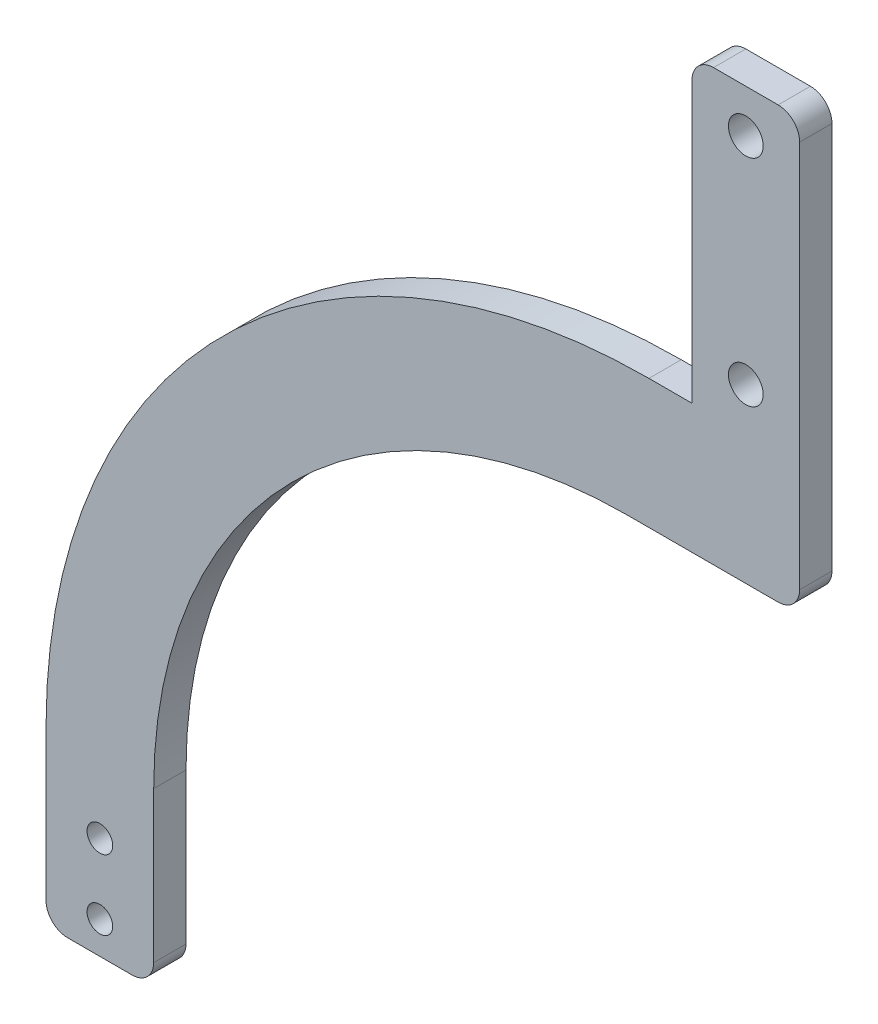
ISO-10303-21;
HEADER;
FILE_DESCRIPTION(('STEP AP214'),'2;1');
FILE_NAME('part.step','',(''),(''),'','','');
FILE_SCHEMA(('AUTOMOTIVE_DESIGN { 1 0 10303 214 1 1 1 1 }'));
ENDSEC;
DATA;
#1=APPLICATION_CONTEXT('core data for automotive mechanical design processes');
#2=APPLICATION_PROTOCOL_DEFINITION('international standard','automotive_design',2000,#1);
#3=PRODUCT_CONTEXT('',#1,'mechanical');
#4=PRODUCT('Part','Part','',(#3));
#5=PRODUCT_RELATED_PRODUCT_CATEGORY('part','',(#4));
#6=PRODUCT_DEFINITION_FORMATION('','',#4);
#7=PRODUCT_DEFINITION_CONTEXT('part definition',#1,'design');
#8=PRODUCT_DEFINITION('design','',#6,#7);
#9=PRODUCT_DEFINITION_SHAPE('','',#8);
#10=(LENGTH_UNIT() NAMED_UNIT(*) SI_UNIT(.MILLI.,.METRE.));
#11=(NAMED_UNIT(*) PLANE_ANGLE_UNIT() SI_UNIT($,.RADIAN.));
#12=(NAMED_UNIT(*) SI_UNIT($,.STERADIAN.) SOLID_ANGLE_UNIT());
#13=UNCERTAINTY_MEASURE_WITH_UNIT(LENGTH_MEASURE(1.E-05),#10,'distance_accuracy_value','');
#14=(GEOMETRIC_REPRESENTATION_CONTEXT(3) GLOBAL_UNCERTAINTY_ASSIGNED_CONTEXT((#13)) GLOBAL_UNIT_ASSIGNED_CONTEXT((#10,
#11,#12)) REPRESENTATION_CONTEXT('',''));
#15=CARTESIAN_POINT('',(0.,0.,0.));
#16=DIRECTION('',(0.,0.,1.));
#17=DIRECTION('',(1.,0.,0.));
#18=AXIS2_PLACEMENT_3D('',#15,#16,#17);
#19=CARTESIAN_POINT('',(0.,0.,1.5));
#20=DIRECTION('',(0.,0.,1.));
#21=DIRECTION('',(1.,0.,0.));
#22=AXIS2_PLACEMENT_3D('',#19,#20,#21);
#23=PLANE('',#22);
#24=CARTESIAN_POINT('',(30.,44.875,1.5));
#25=DIRECTION('',(0.,0.,1.));
#26=DIRECTION('',(1.,0.,0.));
#27=AXIS2_PLACEMENT_3D('',#24,#25,#26);
#28=CIRCLE('',#27,0.806450000000001);
#29=CARTESIAN_POINT('',(30.80645,44.875,1.5));
#30=VERTEX_POINT('',#29);
#31=EDGE_CURVE('E512',#30,#30,#28,.T.);
#32=ORIENTED_EDGE('',*,*,#31,.F.);
#33=EDGE_LOOP('',(#32));
#34=FACE_BOUND('',#33,.T.);
#35=CARTESIAN_POINT('',(0.,1.625,1.5));
#36=DIRECTION('',(0.,0.,1.));
#37=DIRECTION('',(1.,0.,0.));
#38=AXIS2_PLACEMENT_3D('',#35,#36,#37);
#39=CIRCLE('',#38,0.59563);
#40=CARTESIAN_POINT('',(0.595629999999999,1.625,1.5));
#41=VERTEX_POINT('',#40);
#42=EDGE_CURVE('E182',#41,#41,#39,.T.);
#43=ORIENTED_EDGE('',*,*,#42,.F.);
#44=EDGE_LOOP('',(#43));
#45=FACE_BOUND('',#44,.T.);
#46=DIRECTION('',(1.,0.,0.));
#47=VECTOR('',#46,1.);
#48=CARTESIAN_POINT('',(32.5,26.875,1.5));
#49=LINE('',#48,#47);
#50=CARTESIAN_POINT('',(24.5,26.875,1.5));
#51=VERTEX_POINT('',#50);
#52=CARTESIAN_POINT('',(31.5,26.875,1.5));
#53=VERTEX_POINT('',#52);
#54=EDGE_CURVE('E281',#51,#53,#49,.T.);
#55=ORIENTED_EDGE('',*,*,#54,.T.);
#56=CARTESIAN_POINT('',(31.5,27.875,1.5));
#57=DIRECTION('',(0.,0.,1.));
#58=DIRECTION('',(1.,0.,0.));
#59=AXIS2_PLACEMENT_3D('',#56,#57,#58);
#60=CIRCLE('',#59,1.);
#61=CARTESIAN_POINT('',(32.5,27.875,1.5));
#62=VERTEX_POINT('',#61);
#63=EDGE_CURVE('E242',#53,#62,#60,.T.);
#64=ORIENTED_EDGE('',*,*,#63,.T.);
#65=DIRECTION('',(0.,1.,0.));
#66=VECTOR('',#65,1.);
#67=CARTESIAN_POINT('',(32.5,32.875,1.5));
#68=LINE('',#67,#66);
#69=CARTESIAN_POINT('',(32.5,45.875,1.5));
#70=VERTEX_POINT('',#69);
#71=EDGE_CURVE('E286',#62,#70,#68,.T.);
#72=ORIENTED_EDGE('',*,*,#71,.T.);
#73=CARTESIAN_POINT('',(31.5,45.875,1.5));
#74=DIRECTION('',(0.,0.,1.));
#75=DIRECTION('',(1.,0.,0.));
#76=AXIS2_PLACEMENT_3D('',#73,#74,#75);
#77=CIRCLE('',#76,1.);
#78=CARTESIAN_POINT('',(31.5,46.875,1.5));
#79=VERTEX_POINT('',#78);
#80=EDGE_CURVE('E240',#70,#79,#77,.T.);
#81=ORIENTED_EDGE('',*,*,#80,.T.);
#82=DIRECTION('',(-1.,0.,0.));
#83=VECTOR('',#82,1.);
#84=CARTESIAN_POINT('',(27.5,46.875,1.5));
#85=LINE('',#84,#83);
#86=CARTESIAN_POINT('',(28.5,46.875,1.5));
#87=VERTEX_POINT('',#86);
#88=EDGE_CURVE('E155',#79,#87,#85,.T.);
#89=ORIENTED_EDGE('',*,*,#88,.T.);
#90=CARTESIAN_POINT('',(28.5,45.875,1.5));
#91=DIRECTION('',(0.,0.,1.));
#92=DIRECTION('',(1.,0.,0.));
#93=AXIS2_PLACEMENT_3D('',#90,#91,#92);
#94=CIRCLE('',#93,1.);
#95=CARTESIAN_POINT('',(27.5,45.875,1.5));
#96=VERTEX_POINT('',#95);
#97=EDGE_CURVE('E54',#87,#96,#94,.T.);
#98=ORIENTED_EDGE('',*,*,#97,.T.);
#99=DIRECTION('',(0.,-1.,0.));
#100=VECTOR('',#99,1.);
#101=CARTESIAN_POINT('',(27.5,46.875,1.5));
#102=LINE('',#101,#100);
#103=CARTESIAN_POINT('',(27.5,32.875,1.5));
#104=VERTEX_POINT('',#103);
#105=EDGE_CURVE('E145',#96,#104,#102,.T.);
#106=ORIENTED_EDGE('',*,*,#105,.T.);
#107=DIRECTION('',(-1.,0.,0.));
#108=VECTOR('',#107,1.);
#109=CARTESIAN_POINT('',(-2.5,32.875,1.5));
#110=LINE('',#109,#108);
#111=CARTESIAN_POINT('',(25.5,32.875,1.5));
#112=VERTEX_POINT('',#111);
#113=EDGE_CURVE('E150',#104,#112,#110,.T.);
#114=ORIENTED_EDGE('',*,*,#113,.T.);
#115=CARTESIAN_POINT('',(25.5,4.87499999999999,1.5));
#116=DIRECTION('',(0.,0.,1.));
#117=DIRECTION('',(1.,0.,0.));
#118=AXIS2_PLACEMENT_3D('',#115,#116,#117);
#119=CIRCLE('',#118,28.);
#120=CARTESIAN_POINT('',(-2.5,4.87499999999999,1.5));
#121=VERTEX_POINT('',#120);
#122=EDGE_CURVE('E216',#112,#121,#119,.T.);
#123=ORIENTED_EDGE('',*,*,#122,.T.);
#124=DIRECTION('',(0.,-1.,0.));
#125=VECTOR('',#124,1.);
#126=CARTESIAN_POINT('',(-2.5,3.875,1.5));
#127=LINE('',#126,#125);
#128=CARTESIAN_POINT('',(-2.5,-2.125,1.5));
#129=VERTEX_POINT('',#128);
#130=EDGE_CURVE('E171',#121,#129,#127,.T.);
#131=ORIENTED_EDGE('',*,*,#130,.T.);
#132=CARTESIAN_POINT('',(-1.5,-2.125,1.5));
#133=DIRECTION('',(0.,0.,1.));
#134=DIRECTION('',(1.,0.,0.));
#135=AXIS2_PLACEMENT_3D('',#132,#133,#134);
#136=CIRCLE('',#135,1.);
#137=CARTESIAN_POINT('',(-1.5,-3.125,1.5));
#138=VERTEX_POINT('',#137);
#139=EDGE_CURVE('E235',#129,#138,#136,.T.);
#140=ORIENTED_EDGE('',*,*,#139,.T.);
#141=DIRECTION('',(1.,0.,0.));
#142=VECTOR('',#141,1.);
#143=CARTESIAN_POINT('',(2.5,-3.125,1.5));
#144=LINE('',#143,#142);
#145=CARTESIAN_POINT('',(1.5,-3.125,1.5));
#146=VERTEX_POINT('',#145);
#147=EDGE_CURVE('E166',#138,#146,#144,.T.);
#148=ORIENTED_EDGE('',*,*,#147,.T.);
#149=CARTESIAN_POINT('',(1.5,-2.125,1.5));
#150=DIRECTION('',(0.,0.,1.));
#151=DIRECTION('',(1.,0.,0.));
#152=AXIS2_PLACEMENT_3D('',#149,#150,#151);
#153=CIRCLE('',#152,1.);
#154=CARTESIAN_POINT('',(2.5,-2.125,1.5));
#155=VERTEX_POINT('',#154);
#156=EDGE_CURVE('E237',#146,#155,#153,.T.);
#157=ORIENTED_EDGE('',*,*,#156,.T.);
#158=DIRECTION('',(0.,1.,0.));
#159=VECTOR('',#158,1.);
#160=CARTESIAN_POINT('',(2.5,-3.125,1.5));
#161=LINE('',#160,#159);
#162=CARTESIAN_POINT('',(2.5,4.875,1.5));
#163=VERTEX_POINT('',#162);
#164=EDGE_CURVE('E198',#155,#163,#161,.T.);
#165=ORIENTED_EDGE('',*,*,#164,.T.);
#166=CARTESIAN_POINT('',(24.5,4.875,1.5));
#167=DIRECTION('',(0.,0.,1.));
#168=DIRECTION('',(1.,0.,0.));
#169=AXIS2_PLACEMENT_3D('',#166,#167,#168);
#170=CIRCLE('',#169,22.);
#171=EDGE_CURVE('E208',#163,#51,#170,.F.);
#172=ORIENTED_EDGE('',*,*,#171,.T.);
#173=EDGE_LOOP('',(#55,#64,#72,#81,#89,#98,#106,#114,#123,#131,#140,#148,#157,#165,#172));
#174=FACE_BOUND('',#173,.T.);
#175=CARTESIAN_POINT('',(0.,-1.625,1.5));
#176=DIRECTION('',(0.,0.,1.));
#177=DIRECTION('',(1.,0.,0.));
#178=AXIS2_PLACEMENT_3D('',#175,#176,#177);
#179=CIRCLE('',#178,0.59563);
#180=CARTESIAN_POINT('',(0.59563,-1.625,1.5));
#181=VERTEX_POINT('',#180);
#182=EDGE_CURVE('E505',#181,#181,#179,.T.);
#183=ORIENTED_EDGE('',*,*,#182,.F.);
#184=EDGE_LOOP('',(#183));
#185=FACE_BOUND('',#184,.T.);
#186=CARTESIAN_POINT('',(30.,34.875,1.5));
#187=DIRECTION('',(0.,0.,1.));
#188=DIRECTION('',(1.,0.,0.));
#189=AXIS2_PLACEMENT_3D('',#186,#187,#188);
#190=CIRCLE('',#189,0.806450000000001);
#191=CARTESIAN_POINT('',(30.80645,34.875,1.5));
#192=VERTEX_POINT('',#191);
#193=EDGE_CURVE('E517',#192,#192,#190,.T.);
#194=ORIENTED_EDGE('',*,*,#193,.F.);
#195=EDGE_LOOP('',(#194));
#196=FACE_BOUND('',#195,.T.);
#197=ADVANCED_FACE('F39',(#34,#45,#174,#185,#196),#23,.T.);
#198=CARTESIAN_POINT('',(0.,0.,0.));
#199=DIRECTION('',(0.,0.,1.));
#200=DIRECTION('',(1.,0.,0.));
#201=AXIS2_PLACEMENT_3D('',#198,#199,#200);
#202=PLANE('',#201);
#203=DIRECTION('',(0.,1.,0.));
#204=VECTOR('',#203,1.);
#205=CARTESIAN_POINT('',(32.5,46.875,0.));
#206=LINE('',#205,#204);
#207=CARTESIAN_POINT('',(32.5,27.875,0.));
#208=VERTEX_POINT('',#207);
#209=CARTESIAN_POINT('',(32.5,45.875,0.));
#210=VERTEX_POINT('',#209);
#211=EDGE_CURVE('E185',#208,#210,#206,.T.);
#212=ORIENTED_EDGE('',*,*,#211,.F.);
#213=CARTESIAN_POINT('',(31.5,27.875,0.));
#214=DIRECTION('',(0.,0.,1.));
#215=DIRECTION('',(1.,0.,0.));
#216=AXIS2_PLACEMENT_3D('',#213,#214,#215);
#217=CIRCLE('',#216,1.);
#218=CARTESIAN_POINT('',(31.5,26.875,0.));
#219=VERTEX_POINT('',#218);
#220=EDGE_CURVE('E231',#208,#219,#217,.F.);
#221=ORIENTED_EDGE('',*,*,#220,.T.);
#222=DIRECTION('',(1.,0.,0.));
#223=VECTOR('',#222,1.);
#224=CARTESIAN_POINT('',(32.5,26.875,0.));
#225=LINE('',#224,#223);
#226=CARTESIAN_POINT('',(24.5,26.875,0.));
#227=VERTEX_POINT('',#226);
#228=EDGE_CURVE('E181',#227,#219,#225,.T.);
#229=ORIENTED_EDGE('',*,*,#228,.F.);
#230=CARTESIAN_POINT('',(24.5,4.875,0.));
#231=DIRECTION('',(0.,0.,1.));
#232=DIRECTION('',(1.,0.,0.));
#233=AXIS2_PLACEMENT_3D('',#230,#231,#232);
#234=CIRCLE('',#233,22.);
#235=CARTESIAN_POINT('',(2.5,4.875,0.));
#236=VERTEX_POINT('',#235);
#237=EDGE_CURVE('E205',#227,#236,#234,.T.);
#238=ORIENTED_EDGE('',*,*,#237,.T.);
#239=DIRECTION('',(0.,1.,0.));
#240=VECTOR('',#239,1.);
#241=CARTESIAN_POINT('',(2.5,26.875,0.));
#242=LINE('',#241,#240);
#243=CARTESIAN_POINT('',(2.5,-2.125,0.));
#244=VERTEX_POINT('',#243);
#245=EDGE_CURVE('E179',#244,#236,#242,.T.);
#246=ORIENTED_EDGE('',*,*,#245,.F.);
#247=CARTESIAN_POINT('',(1.5,-2.125,0.));
#248=DIRECTION('',(0.,0.,1.));
#249=DIRECTION('',(1.,0.,0.));
#250=AXIS2_PLACEMENT_3D('',#247,#248,#249);
#251=CIRCLE('',#250,1.);
#252=CARTESIAN_POINT('',(1.5,-3.125,0.));
#253=VERTEX_POINT('',#252);
#254=EDGE_CURVE('E225',#244,#253,#251,.F.);
#255=ORIENTED_EDGE('',*,*,#254,.T.);
#256=DIRECTION('',(1.,0.,0.));
#257=VECTOR('',#256,1.);
#258=CARTESIAN_POINT('',(2.5,-3.125,0.));
#259=LINE('',#258,#257);
#260=CARTESIAN_POINT('',(-1.5,-3.125,0.));
#261=VERTEX_POINT('',#260);
#262=EDGE_CURVE('E196',#261,#253,#259,.T.);
#263=ORIENTED_EDGE('',*,*,#262,.F.);
#264=CARTESIAN_POINT('',(-1.5,-2.125,0.));
#265=DIRECTION('',(0.,0.,1.));
#266=DIRECTION('',(1.,0.,0.));
#267=AXIS2_PLACEMENT_3D('',#264,#265,#266);
#268=CIRCLE('',#267,1.);
#269=CARTESIAN_POINT('',(-2.5,-2.125,0.));
#270=VERTEX_POINT('',#269);
#271=EDGE_CURVE('E223',#261,#270,#268,.F.);
#272=ORIENTED_EDGE('',*,*,#271,.T.);
#273=DIRECTION('',(0.,-1.,0.));
#274=VECTOR('',#273,1.);
#275=CARTESIAN_POINT('',(-2.5,-3.125,0.));
#276=LINE('',#275,#274);
#277=CARTESIAN_POINT('',(-2.5,4.87499999999999,0.));
#278=VERTEX_POINT('',#277);
#279=EDGE_CURVE('E193',#278,#270,#276,.T.);
#280=ORIENTED_EDGE('',*,*,#279,.F.);
#281=CARTESIAN_POINT('',(25.5,4.87499999999999,0.));
#282=DIRECTION('',(0.,0.,1.));
#283=DIRECTION('',(1.,0.,0.));
#284=AXIS2_PLACEMENT_3D('',#281,#282,#283);
#285=CIRCLE('',#284,28.);
#286=CARTESIAN_POINT('',(25.5,32.875,0.));
#287=VERTEX_POINT('',#286);
#288=EDGE_CURVE('E213',#278,#287,#285,.F.);
#289=ORIENTED_EDGE('',*,*,#288,.T.);
#290=DIRECTION('',(-1.,0.,0.));
#291=VECTOR('',#290,1.);
#292=CARTESIAN_POINT('',(-2.5,32.875,0.));
#293=LINE('',#292,#291);
#294=CARTESIAN_POINT('',(27.5,32.875,0.));
#295=VERTEX_POINT('',#294);
#296=EDGE_CURVE('E191',#295,#287,#293,.T.);
#297=ORIENTED_EDGE('',*,*,#296,.F.);
#298=DIRECTION('',(0.,-1.,0.));
#299=VECTOR('',#298,1.);
#300=CARTESIAN_POINT('',(27.5,46.875,0.));
#301=LINE('',#300,#299);
#302=CARTESIAN_POINT('',(27.5,45.875,0.));
#303=VERTEX_POINT('',#302);
#304=EDGE_CURVE('E161',#303,#295,#301,.T.);
#305=ORIENTED_EDGE('',*,*,#304,.F.);
#306=CARTESIAN_POINT('',(28.5,45.875,0.));
#307=DIRECTION('',(0.,0.,1.));
#308=DIRECTION('',(1.,0.,0.));
#309=AXIS2_PLACEMENT_3D('',#306,#307,#308);
#310=CIRCLE('',#309,1.);
#311=CARTESIAN_POINT('',(28.5,46.875,0.));
#312=VERTEX_POINT('',#311);
#313=EDGE_CURVE('E227',#303,#312,#310,.F.);
#314=ORIENTED_EDGE('',*,*,#313,.T.);
#315=DIRECTION('',(-1.,0.,0.));
#316=VECTOR('',#315,1.);
#317=CARTESIAN_POINT('',(27.5,46.875,0.));
#318=LINE('',#317,#316);
#319=CARTESIAN_POINT('',(31.5,46.875,0.));
#320=VERTEX_POINT('',#319);
#321=EDGE_CURVE('E188',#320,#312,#318,.T.);
#322=ORIENTED_EDGE('',*,*,#321,.F.);
#323=CARTESIAN_POINT('',(31.5,45.875,0.));
#324=DIRECTION('',(0.,0.,1.));
#325=DIRECTION('',(1.,0.,0.));
#326=AXIS2_PLACEMENT_3D('',#323,#324,#325);
#327=CIRCLE('',#326,1.);
#328=EDGE_CURVE('E229',#320,#210,#327,.F.);
#329=ORIENTED_EDGE('',*,*,#328,.T.);
#330=EDGE_LOOP('',(#212,#221,#229,#238,#246,#255,#263,#272,#280,#289,#297,#305,#314,#322,#329));
#331=FACE_BOUND('',#330,.T.);
#332=CARTESIAN_POINT('',(0.,1.625,0.));
#333=DIRECTION('',(0.,0.,1.));
#334=DIRECTION('',(1.,0.,0.));
#335=AXIS2_PLACEMENT_3D('',#332,#333,#334);
#336=CIRCLE('',#335,0.59563);
#337=CARTESIAN_POINT('',(0.595629999999999,1.625,0.));
#338=VERTEX_POINT('',#337);
#339=EDGE_CURVE('E504',#338,#338,#336,.T.);
#340=ORIENTED_EDGE('',*,*,#339,.T.);
#341=EDGE_LOOP('',(#340));
#342=FACE_BOUND('',#341,.T.);
#343=CARTESIAN_POINT('',(0.,-1.625,0.));
#344=DIRECTION('',(0.,0.,1.));
#345=DIRECTION('',(1.,0.,0.));
#346=AXIS2_PLACEMENT_3D('',#343,#344,#345);
#347=CIRCLE('',#346,0.59563);
#348=CARTESIAN_POINT('',(0.59563,-1.625,0.));
#349=VERTEX_POINT('',#348);
#350=EDGE_CURVE('E508',#349,#349,#347,.T.);
#351=ORIENTED_EDGE('',*,*,#350,.T.);
#352=EDGE_LOOP('',(#351));
#353=FACE_BOUND('',#352,.T.);
#354=CARTESIAN_POINT('',(30.,44.875,0.));
#355=DIRECTION('',(0.,0.,1.));
#356=DIRECTION('',(1.,0.,0.));
#357=AXIS2_PLACEMENT_3D('',#354,#355,#356);
#358=CIRCLE('',#357,0.806450000000001);
#359=CARTESIAN_POINT('',(30.80645,44.875,0.));
#360=VERTEX_POINT('',#359);
#361=EDGE_CURVE('E514',#360,#360,#358,.T.);
#362=ORIENTED_EDGE('',*,*,#361,.T.);
#363=EDGE_LOOP('',(#362));
#364=FACE_BOUND('',#363,.T.);
#365=CARTESIAN_POINT('',(30.,34.875,0.));
#366=DIRECTION('',(0.,0.,1.));
#367=DIRECTION('',(1.,0.,0.));
#368=AXIS2_PLACEMENT_3D('',#365,#366,#367);
#369=CIRCLE('',#368,0.806450000000001);
#370=CARTESIAN_POINT('',(30.80645,34.875,0.));
#371=VERTEX_POINT('',#370);
#372=EDGE_CURVE('E520',#371,#371,#369,.T.);
#373=ORIENTED_EDGE('',*,*,#372,.T.);
#374=EDGE_LOOP('',(#373));
#375=FACE_BOUND('',#374,.T.);
#376=ADVANCED_FACE('F272',(#331,#342,#353,#364,#375),#202,.F.);
#377=CARTESIAN_POINT('',(2.5,26.875,1.5));
#378=DIRECTION('',(-1.,0.,0.));
#379=DIRECTION('',(0.,-1.,0.));
#380=AXIS2_PLACEMENT_3D('',#377,#378,#379);
#381=PLANE('',#380);
#382=ORIENTED_EDGE('',*,*,#164,.F.);
#383=DIRECTION('',(0.,0.,-1.));
#384=VECTOR('',#383,1.);
#385=CARTESIAN_POINT('',(2.5,-2.125,1.5));
#386=LINE('',#385,#384);
#387=EDGE_CURVE('E250',#155,#244,#386,.T.);
#388=ORIENTED_EDGE('',*,*,#387,.T.);
#389=ORIENTED_EDGE('',*,*,#245,.T.);
#390=DIRECTION('',(0.,0.,-1.));
#391=VECTOR('',#390,1.);
#392=CARTESIAN_POINT('',(2.5,4.875,1.5));
#393=LINE('',#392,#391);
#394=EDGE_CURVE('E202',#236,#163,#393,.F.);
#395=ORIENTED_EDGE('',*,*,#394,.T.);
#396=EDGE_LOOP('',(#382,#388,#389,#395));
#397=FACE_BOUND('',#396,.T.);
#398=ADVANCED_FACE('F269',(#397),#381,.F.);
#399=CARTESIAN_POINT('',(32.5,26.875,1.5));
#400=DIRECTION('',(0.,1.,0.));
#401=DIRECTION('',(-1.,0.,0.));
#402=AXIS2_PLACEMENT_3D('',#399,#400,#401);
#403=PLANE('',#402);
#404=ORIENTED_EDGE('',*,*,#228,.T.);
#405=DIRECTION('',(0.,0.,-1.));
#406=VECTOR('',#405,1.);
#407=CARTESIAN_POINT('',(31.5,26.875,1.5));
#408=LINE('',#407,#406);
#409=EDGE_CURVE('E233',#219,#53,#408,.F.);
#410=ORIENTED_EDGE('',*,*,#409,.T.);
#411=ORIENTED_EDGE('',*,*,#54,.F.);
#412=DIRECTION('',(0.,0.,-1.));
#413=VECTOR('',#412,1.);
#414=CARTESIAN_POINT('',(24.5,26.875,0.));
#415=LINE('',#414,#413);
#416=EDGE_CURVE('E165',#51,#227,#415,.T.);
#417=ORIENTED_EDGE('',*,*,#416,.T.);
#418=EDGE_LOOP('',(#404,#410,#411,#417));
#419=FACE_BOUND('',#418,.T.);
#420=ADVANCED_FACE('F284',(#419),#403,.F.);
#421=CARTESIAN_POINT('',(32.5,46.875,1.5));
#422=DIRECTION('',(-1.,0.,0.));
#423=DIRECTION('',(0.,-1.,0.));
#424=AXIS2_PLACEMENT_3D('',#421,#422,#423);
#425=PLANE('',#424);
#426=ORIENTED_EDGE('',*,*,#71,.F.);
#427=DIRECTION('',(0.,0.,-1.));
#428=VECTOR('',#427,1.);
#429=CARTESIAN_POINT('',(32.5,27.875,1.5));
#430=LINE('',#429,#428);
#431=EDGE_CURVE('E220',#62,#208,#430,.T.);
#432=ORIENTED_EDGE('',*,*,#431,.T.);
#433=ORIENTED_EDGE('',*,*,#211,.T.);
#434=DIRECTION('',(0.,0.,-1.));
#435=VECTOR('',#434,1.);
#436=CARTESIAN_POINT('',(32.5,45.875,1.5));
#437=LINE('',#436,#435);
#438=EDGE_CURVE('E218',#210,#70,#437,.F.);
#439=ORIENTED_EDGE('',*,*,#438,.T.);
#440=EDGE_LOOP('',(#426,#432,#433,#439));
#441=FACE_BOUND('',#440,.T.);
#442=ADVANCED_FACE('F335',(#441),#425,.F.);
#443=CARTESIAN_POINT('',(27.5,46.875,1.5));
#444=DIRECTION('',(0.,-1.,0.));
#445=DIRECTION('',(0.,0.,-1.));
#446=AXIS2_PLACEMENT_3D('',#443,#444,#445);
#447=PLANE('',#446);
#448=ORIENTED_EDGE('',*,*,#88,.F.);
#449=DIRECTION('',(0.,0.,-1.));
#450=VECTOR('',#449,1.);
#451=CARTESIAN_POINT('',(31.5,46.875,1.5));
#452=LINE('',#451,#450);
#453=EDGE_CURVE('E245',#79,#320,#452,.T.);
#454=ORIENTED_EDGE('',*,*,#453,.T.);
#455=ORIENTED_EDGE('',*,*,#321,.T.);
#456=DIRECTION('',(0.,0.,-1.));
#457=VECTOR('',#456,1.);
#458=CARTESIAN_POINT('',(28.5,46.875,1.5));
#459=LINE('',#458,#457);
#460=EDGE_CURVE('E62',#312,#87,#459,.F.);
#461=ORIENTED_EDGE('',*,*,#460,.T.);
#462=EDGE_LOOP('',(#448,#454,#455,#461));
#463=FACE_BOUND('',#462,.T.);
#464=ADVANCED_FACE('F332',(#463),#447,.F.);
#465=CARTESIAN_POINT('',(27.5,46.875,1.5));
#466=DIRECTION('',(1.,0.,0.));
#467=DIRECTION('',(0.,1.,0.));
#468=AXIS2_PLACEMENT_3D('',#465,#466,#467);
#469=PLANE('',#468);
#470=ORIENTED_EDGE('',*,*,#105,.F.);
#471=DIRECTION('',(0.,0.,-1.));
#472=VECTOR('',#471,1.);
#473=CARTESIAN_POINT('',(27.5,45.875,1.5));
#474=LINE('',#473,#472);
#475=EDGE_CURVE('E248',#96,#303,#474,.T.);
#476=ORIENTED_EDGE('',*,*,#475,.T.);
#477=ORIENTED_EDGE('',*,*,#304,.T.);
#478=DIRECTION('',(0.,0.,-1.));
#479=VECTOR('',#478,1.);
#480=CARTESIAN_POINT('',(27.5,32.875,1.5));
#481=LINE('',#480,#479);
#482=EDGE_CURVE('E158',#104,#295,#481,.T.);
#483=ORIENTED_EDGE('',*,*,#482,.F.);
#484=EDGE_LOOP('',(#470,#476,#477,#483));
#485=FACE_BOUND('',#484,.T.);
#486=ADVANCED_FACE('F159',(#485),#469,.F.);
#487=CARTESIAN_POINT('',(-2.5,32.875,1.5));
#488=DIRECTION('',(0.,-1.,0.));
#489=DIRECTION('',(0.,0.,-1.));
#490=AXIS2_PLACEMENT_3D('',#487,#488,#489);
#491=PLANE('',#490);
#492=ORIENTED_EDGE('',*,*,#296,.T.);
#493=DIRECTION('',(0.,0.,-1.));
#494=VECTOR('',#493,1.);
#495=CARTESIAN_POINT('',(25.5,32.875,1.5));
#496=LINE('',#495,#494);
#497=EDGE_CURVE('E170',#287,#112,#496,.F.);
#498=ORIENTED_EDGE('',*,*,#497,.T.);
#499=ORIENTED_EDGE('',*,*,#113,.F.);
#500=ORIENTED_EDGE('',*,*,#482,.T.);
#501=EDGE_LOOP('',(#492,#498,#499,#500));
#502=FACE_BOUND('',#501,.T.);
#503=ADVANCED_FACE('F168',(#502),#491,.F.);
#504=CARTESIAN_POINT('',(-2.5,-3.125,1.5));
#505=DIRECTION('',(1.,0.,0.));
#506=DIRECTION('',(0.,0.,-1.));
#507=AXIS2_PLACEMENT_3D('',#504,#505,#506);
#508=PLANE('',#507);
#509=ORIENTED_EDGE('',*,*,#279,.T.);
#510=DIRECTION('',(0.,0.,-1.));
#511=VECTOR('',#510,1.);
#512=CARTESIAN_POINT('',(-2.5,-2.125,1.5));
#513=LINE('',#512,#511);
#514=EDGE_CURVE('E11',#270,#129,#513,.F.);
#515=ORIENTED_EDGE('',*,*,#514,.T.);
#516=ORIENTED_EDGE('',*,*,#130,.F.);
#517=DIRECTION('',(0.,0.,-1.));
#518=VECTOR('',#517,1.);
#519=CARTESIAN_POINT('',(-2.5,4.87499999999999,1.5));
#520=LINE('',#519,#518);
#521=EDGE_CURVE('E210',#121,#278,#520,.T.);
#522=ORIENTED_EDGE('',*,*,#521,.T.);
#523=EDGE_LOOP('',(#509,#515,#516,#522));
#524=FACE_BOUND('',#523,.T.);
#525=ADVANCED_FACE('F303',(#524),#508,.F.);
#526=CARTESIAN_POINT('',(2.5,-3.125,1.5));
#527=DIRECTION('',(0.,1.,0.));
#528=DIRECTION('',(0.,0.,1.));
#529=AXIS2_PLACEMENT_3D('',#526,#527,#528);
#530=PLANE('',#529);
#531=ORIENTED_EDGE('',*,*,#262,.T.);
#532=DIRECTION('',(0.,0.,-1.));
#533=VECTOR('',#532,1.);
#534=CARTESIAN_POINT('',(1.5,-3.125,1.5));
#535=LINE('',#534,#533);
#536=EDGE_CURVE('E47',#253,#146,#535,.F.);
#537=ORIENTED_EDGE('',*,*,#536,.T.);
#538=ORIENTED_EDGE('',*,*,#147,.F.);
#539=DIRECTION('',(0.,0.,-1.));
#540=VECTOR('',#539,1.);
#541=CARTESIAN_POINT('',(-1.5,-3.125,1.5));
#542=LINE('',#541,#540);
#543=EDGE_CURVE('E253',#138,#261,#542,.T.);
#544=ORIENTED_EDGE('',*,*,#543,.T.);
#545=EDGE_LOOP('',(#531,#537,#538,#544));
#546=FACE_BOUND('',#545,.T.);
#547=ADVANCED_FACE('F258',(#546),#530,.F.);
#548=CARTESIAN_POINT('',(0.,1.625,1.5));
#549=DIRECTION('',(0.,0.,-1.));
#550=DIRECTION('',(-1.,0.,0.));
#551=AXIS2_PLACEMENT_3D('',#548,#549,#550);
#552=CYLINDRICAL_SURFACE('',#551,0.59563);
#553=ORIENTED_EDGE('',*,*,#42,.T.);
#554=EDGE_LOOP('',(#553));
#555=FACE_BOUND('',#554,.T.);
#556=ORIENTED_EDGE('',*,*,#339,.F.);
#557=EDGE_LOOP('',(#556));
#558=FACE_BOUND('',#557,.T.);
#559=ADVANCED_FACE('F321',(#555,#558),#552,.F.);
#560=CARTESIAN_POINT('',(0.,-1.625,1.5));
#561=DIRECTION('',(0.,0.,-1.));
#562=DIRECTION('',(-1.,0.,0.));
#563=AXIS2_PLACEMENT_3D('',#560,#561,#562);
#564=CYLINDRICAL_SURFACE('',#563,0.59563);
#565=ORIENTED_EDGE('',*,*,#182,.T.);
#566=EDGE_LOOP('',(#565));
#567=FACE_BOUND('',#566,.T.);
#568=ORIENTED_EDGE('',*,*,#350,.F.);
#569=EDGE_LOOP('',(#568));
#570=FACE_BOUND('',#569,.T.);
#571=ADVANCED_FACE('F407',(#567,#570),#564,.F.);
#572=CARTESIAN_POINT('',(30.,44.875,1.5));
#573=DIRECTION('',(0.,0.,-1.));
#574=DIRECTION('',(-1.,0.,0.));
#575=AXIS2_PLACEMENT_3D('',#572,#573,#574);
#576=CYLINDRICAL_SURFACE('',#575,0.806450000000001);
#577=ORIENTED_EDGE('',*,*,#31,.T.);
#578=EDGE_LOOP('',(#577));
#579=FACE_BOUND('',#578,.T.);
#580=ORIENTED_EDGE('',*,*,#361,.F.);
#581=EDGE_LOOP('',(#580));
#582=FACE_BOUND('',#581,.T.);
#583=ADVANCED_FACE('F398',(#579,#582),#576,.F.);
#584=CARTESIAN_POINT('',(30.,34.875,1.5));
#585=DIRECTION('',(0.,0.,-1.));
#586=DIRECTION('',(-1.,0.,0.));
#587=AXIS2_PLACEMENT_3D('',#584,#585,#586);
#588=CYLINDRICAL_SURFACE('',#587,0.806450000000001);
#589=ORIENTED_EDGE('',*,*,#193,.T.);
#590=EDGE_LOOP('',(#589));
#591=FACE_BOUND('',#590,.T.);
#592=ORIENTED_EDGE('',*,*,#372,.F.);
#593=EDGE_LOOP('',(#592));
#594=FACE_BOUND('',#593,.T.);
#595=ADVANCED_FACE('F345',(#591,#594),#588,.F.);
#596=CARTESIAN_POINT('',(24.5,4.875,1.5));
#597=DIRECTION('',(0.,0.,1.));
#598=DIRECTION('',(1.,0.,0.));
#599=AXIS2_PLACEMENT_3D('',#596,#597,#598);
#600=CYLINDRICAL_SURFACE('',#599,22.);
#601=ORIENTED_EDGE('',*,*,#171,.F.);
#602=ORIENTED_EDGE('',*,*,#394,.F.);
#603=ORIENTED_EDGE('',*,*,#237,.F.);
#604=ORIENTED_EDGE('',*,*,#416,.F.);
#605=EDGE_LOOP('',(#601,#602,#603,#604));
#606=FACE_BOUND('',#605,.T.);
#607=ADVANCED_FACE('F279',(#606),#600,.F.);
#608=CARTESIAN_POINT('',(25.5,4.87499999999999,1.5));
#609=DIRECTION('',(0.,0.,-1.));
#610=DIRECTION('',(-1.,0.,0.));
#611=AXIS2_PLACEMENT_3D('',#608,#609,#610);
#612=CYLINDRICAL_SURFACE('',#611,28.);
#613=ORIENTED_EDGE('',*,*,#122,.F.);
#614=ORIENTED_EDGE('',*,*,#497,.F.);
#615=ORIENTED_EDGE('',*,*,#288,.F.);
#616=ORIENTED_EDGE('',*,*,#521,.F.);
#617=EDGE_LOOP('',(#613,#614,#615,#616));
#618=FACE_BOUND('',#617,.T.);
#619=ADVANCED_FACE('F299',(#618),#612,.T.);
#620=CARTESIAN_POINT('',(31.5,27.875,1.5));
#621=DIRECTION('',(0.,0.,-1.));
#622=DIRECTION('',(-1.,0.,0.));
#623=AXIS2_PLACEMENT_3D('',#620,#621,#622);
#624=CYLINDRICAL_SURFACE('',#623,1.);
#625=ORIENTED_EDGE('',*,*,#63,.F.);
#626=ORIENTED_EDGE('',*,*,#409,.F.);
#627=ORIENTED_EDGE('',*,*,#220,.F.);
#628=ORIENTED_EDGE('',*,*,#431,.F.);
#629=EDGE_LOOP('',(#625,#626,#627,#628));
#630=FACE_BOUND('',#629,.T.);
#631=ADVANCED_FACE('F347',(#630),#624,.T.);
#632=CARTESIAN_POINT('',(31.5,45.875,1.5));
#633=DIRECTION('',(0.,0.,-1.));
#634=DIRECTION('',(-1.,0.,0.));
#635=AXIS2_PLACEMENT_3D('',#632,#633,#634);
#636=CYLINDRICAL_SURFACE('',#635,1.);
#637=ORIENTED_EDGE('',*,*,#80,.F.);
#638=ORIENTED_EDGE('',*,*,#438,.F.);
#639=ORIENTED_EDGE('',*,*,#328,.F.);
#640=ORIENTED_EDGE('',*,*,#453,.F.);
#641=EDGE_LOOP('',(#637,#638,#639,#640));
#642=FACE_BOUND('',#641,.T.);
#643=ADVANCED_FACE('F350',(#642),#636,.T.);
#644=CARTESIAN_POINT('',(28.5,45.875,1.5));
#645=DIRECTION('',(0.,0.,-1.));
#646=DIRECTION('',(-1.,0.,0.));
#647=AXIS2_PLACEMENT_3D('',#644,#645,#646);
#648=CYLINDRICAL_SURFACE('',#647,1.);
#649=ORIENTED_EDGE('',*,*,#97,.F.);
#650=ORIENTED_EDGE('',*,*,#460,.F.);
#651=ORIENTED_EDGE('',*,*,#313,.F.);
#652=ORIENTED_EDGE('',*,*,#475,.F.);
#653=EDGE_LOOP('',(#649,#650,#651,#652));
#654=FACE_BOUND('',#653,.T.);
#655=ADVANCED_FACE('F295',(#654),#648,.T.);
#656=CARTESIAN_POINT('',(1.5,-2.125,1.5));
#657=DIRECTION('',(0.,0.,-1.));
#658=DIRECTION('',(-1.,0.,0.));
#659=AXIS2_PLACEMENT_3D('',#656,#657,#658);
#660=CYLINDRICAL_SURFACE('',#659,1.);
#661=ORIENTED_EDGE('',*,*,#156,.F.);
#662=ORIENTED_EDGE('',*,*,#536,.F.);
#663=ORIENTED_EDGE('',*,*,#254,.F.);
#664=ORIENTED_EDGE('',*,*,#387,.F.);
#665=EDGE_LOOP('',(#661,#662,#663,#664));
#666=FACE_BOUND('',#665,.T.);
#667=ADVANCED_FACE('F266',(#666),#660,.T.);
#668=CARTESIAN_POINT('',(-1.5,-2.125,1.5));
#669=DIRECTION('',(0.,0.,-1.));
#670=DIRECTION('',(-1.,0.,0.));
#671=AXIS2_PLACEMENT_3D('',#668,#669,#670);
#672=CYLINDRICAL_SURFACE('',#671,1.);
#673=ORIENTED_EDGE('',*,*,#139,.F.);
#674=ORIENTED_EDGE('',*,*,#514,.F.);
#675=ORIENTED_EDGE('',*,*,#271,.F.);
#676=ORIENTED_EDGE('',*,*,#543,.F.);
#677=EDGE_LOOP('',(#673,#674,#675,#676));
#678=FACE_BOUND('',#677,.T.);
#679=ADVANCED_FACE('F41',(#678),#672,.T.);
#680=CLOSED_SHELL('',(#197,#376,#398,#420,#442,#464,#486,#503,#525,#547,#559,#571,#583,#595,
#607,#619,#631,#643,#655,#667,#679));
#681=MANIFOLD_SOLID_BREP('B2',#680);
#682=ADVANCED_BREP_SHAPE_REPRESENTATION('',(#18,#681),#14);
#683=SHAPE_DEFINITION_REPRESENTATION(#9,#682);
ENDSEC;
END-ISO-10303-21;
